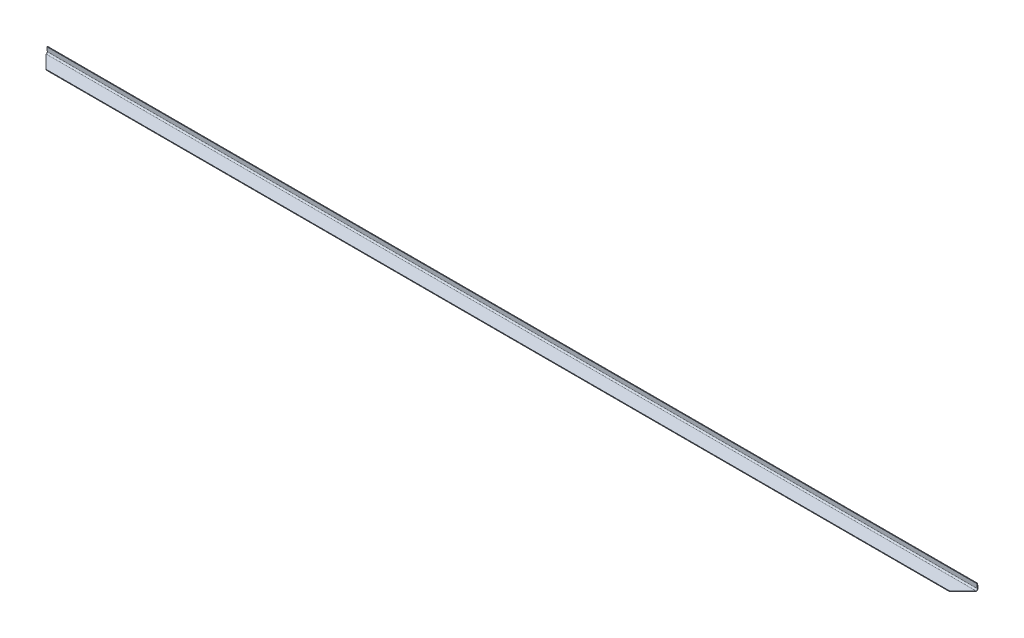
ISO-10303-21;
HEADER;
FILE_DESCRIPTION(('STEP AP214'),'2;1');
FILE_NAME('part.step','',(''),(''),'','','');
FILE_SCHEMA(('AUTOMOTIVE_DESIGN { 1 0 10303 214 1 1 1 1 }'));
ENDSEC;
DATA;
#1=APPLICATION_CONTEXT('core data for automotive mechanical design processes');
#2=APPLICATION_PROTOCOL_DEFINITION('international standard','automotive_design',2000,#1);
#3=PRODUCT_CONTEXT('',#1,'mechanical');
#4=PRODUCT('Part','Part','',(#3));
#5=PRODUCT_RELATED_PRODUCT_CATEGORY('part','',(#4));
#6=PRODUCT_DEFINITION_FORMATION('','',#4);
#7=PRODUCT_DEFINITION_CONTEXT('part definition',#1,'design');
#8=PRODUCT_DEFINITION('design','',#6,#7);
#9=PRODUCT_DEFINITION_SHAPE('','',#8);
#10=(LENGTH_UNIT() NAMED_UNIT(*) SI_UNIT(.MILLI.,.METRE.));
#11=(NAMED_UNIT(*) PLANE_ANGLE_UNIT() SI_UNIT($,.RADIAN.));
#12=(NAMED_UNIT(*) SI_UNIT($,.STERADIAN.) SOLID_ANGLE_UNIT());
#13=UNCERTAINTY_MEASURE_WITH_UNIT(LENGTH_MEASURE(1.E-05),#10,'distance_accuracy_value','');
#14=(GEOMETRIC_REPRESENTATION_CONTEXT(3) GLOBAL_UNCERTAINTY_ASSIGNED_CONTEXT((#13)) GLOBAL_UNIT_ASSIGNED_CONTEXT((#10,
#11,#12)) REPRESENTATION_CONTEXT('',''));
#15=CARTESIAN_POINT('',(0.,0.,0.));
#16=DIRECTION('',(0.,0.,1.));
#17=DIRECTION('',(1.,0.,0.));
#18=AXIS2_PLACEMENT_3D('',#15,#16,#17);
#19=CARTESIAN_POINT('',(20.,1.,20.0000000000002));
#20=DIRECTION('',(0.,0.,1.));
#21=DIRECTION('',(1.,0.,0.));
#22=AXIS2_PLACEMENT_3D('',#19,#20,#21);
#23=PLANE('',#22);
#24=DIRECTION('',(0.,1.,0.));
#25=VECTOR('',#24,1.);
#26=CARTESIAN_POINT('',(20.,1.,20.0000000000002));
#27=LINE('',#26,#25);
#28=CARTESIAN_POINT('',(20.,0.,20.0000000000002));
#29=VERTEX_POINT('',#28);
#30=CARTESIAN_POINT('',(20.,1.,20.0000000000002));
#31=VERTEX_POINT('',#30);
#32=EDGE_CURVE('E13',#29,#31,#27,.T.);
#33=ORIENTED_EDGE('',*,*,#32,.F.);
#34=DIRECTION('',(1.,0.,0.));
#35=VECTOR('',#34,1.);
#36=CARTESIAN_POINT('',(0.,0.,20.0000000000002));
#37=LINE('',#36,#35);
#38=CARTESIAN_POINT('',(1390.,0.,20.0000000000003));
#39=VERTEX_POINT('',#38);
#40=EDGE_CURVE('E135',#29,#39,#37,.T.);
#41=ORIENTED_EDGE('',*,*,#40,.T.);
#42=DIRECTION('',(0.,1.,0.));
#43=VECTOR('',#42,1.);
#44=CARTESIAN_POINT('',(1390.,1.,20.0000000000003));
#45=LINE('',#44,#43);
#46=CARTESIAN_POINT('',(1390.,1.,20.0000000000003));
#47=VERTEX_POINT('',#46);
#48=EDGE_CURVE('E67',#39,#47,#45,.T.);
#49=ORIENTED_EDGE('',*,*,#48,.T.);
#50=DIRECTION('',(1.,0.,0.));
#51=VECTOR('',#50,1.);
#52=CARTESIAN_POINT('',(20.,1.,20.0000000000002));
#53=LINE('',#52,#51);
#54=EDGE_CURVE('E120',#31,#47,#53,.T.);
#55=ORIENTED_EDGE('',*,*,#54,.F.);
#56=EDGE_LOOP('',(#33,#41,#49,#55));
#57=FACE_BOUND('',#56,.T.);
#58=ADVANCED_FACE('F57',(#57),#23,.T.);
#59=CARTESIAN_POINT('',(1390.,1.,20.0000000000003));
#60=DIRECTION('',(0.707106781186542,0.,0.707106781186554));
#61=DIRECTION('',(0.707106781186554,0.,-0.707106781186542));
#62=AXIS2_PLACEMENT_3D('',#59,#60,#61);
#63=PLANE('',#62);
#64=ORIENTED_EDGE('',*,*,#48,.F.);
#65=DIRECTION('',(0.707106781186554,0.,-0.707106781186542));
#66=VECTOR('',#65,1.);
#67=CARTESIAN_POINT('',(1390.,0.,20.0000000000003));
#68=LINE('',#67,#66);
#69=CARTESIAN_POINT('',(1410.,0.,0.));
#70=VERTEX_POINT('',#69);
#71=EDGE_CURVE('E133',#39,#70,#68,.T.);
#72=ORIENTED_EDGE('',*,*,#71,.T.);
#73=DIRECTION('',(0.,1.,0.));
#74=VECTOR('',#73,1.);
#75=CARTESIAN_POINT('',(1410.,1.,0.));
#76=LINE('',#75,#74);
#77=CARTESIAN_POINT('',(1410.,1.,0.));
#78=VERTEX_POINT('',#77);
#79=EDGE_CURVE('E75',#70,#78,#76,.T.);
#80=ORIENTED_EDGE('',*,*,#79,.T.);
#81=DIRECTION('',(0.707106781186554,0.,-0.707106781186542));
#82=VECTOR('',#81,1.);
#83=CARTESIAN_POINT('',(1390.,1.,20.0000000000003));
#84=LINE('',#83,#82);
#85=EDGE_CURVE('E124',#47,#78,#84,.T.);
#86=ORIENTED_EDGE('',*,*,#85,.F.);
#87=EDGE_LOOP('',(#64,#72,#80,#86));
#88=FACE_BOUND('',#87,.T.);
#89=ADVANCED_FACE('F225',(#88),#63,.T.);
#90=CARTESIAN_POINT('',(0.,1.,0.));
#91=DIRECTION('',(-0.707106781186551,0.,0.707106781186544));
#92=DIRECTION('',(0.707106781186544,0.,0.707106781186551));
#93=AXIS2_PLACEMENT_3D('',#90,#91,#92);
#94=PLANE('',#93);
#95=DIRECTION('',(0.707106781186544,0.,0.707106781186551));
#96=VECTOR('',#95,1.);
#97=CARTESIAN_POINT('',(0.,0.,0.));
#98=LINE('',#97,#96);
#99=CARTESIAN_POINT('',(0.,0.,0.));
#100=VERTEX_POINT('',#99);
#101=EDGE_CURVE('E98',#100,#29,#98,.T.);
#102=ORIENTED_EDGE('',*,*,#101,.T.);
#103=ORIENTED_EDGE('',*,*,#32,.T.);
#104=DIRECTION('',(0.707106781186544,0.,0.707106781186551));
#105=VECTOR('',#104,1.);
#106=CARTESIAN_POINT('',(0.,1.,0.));
#107=LINE('',#106,#105);
#108=CARTESIAN_POINT('',(0.,1.,0.));
#109=VERTEX_POINT('',#108);
#110=EDGE_CURVE('E115',#109,#31,#107,.T.);
#111=ORIENTED_EDGE('',*,*,#110,.F.);
#112=DIRECTION('',(0.,1.,0.));
#113=VECTOR('',#112,1.);
#114=CARTESIAN_POINT('',(0.,1.,0.));
#115=LINE('',#114,#113);
#116=EDGE_CURVE('E61',#100,#109,#115,.T.);
#117=ORIENTED_EDGE('',*,*,#116,.F.);
#118=EDGE_LOOP('',(#102,#103,#111,#117));
#119=FACE_BOUND('',#118,.T.);
#120=ADVANCED_FACE('F59',(#119),#94,.T.);
#121=CARTESIAN_POINT('',(0.,1.,0.));
#122=DIRECTION('',(0.,1.,0.));
#123=DIRECTION('',(0.,0.,1.));
#124=AXIS2_PLACEMENT_3D('',#121,#122,#123);
#125=PLANE('',#124);
#126=DIRECTION('',(-1.,0.,0.));
#127=VECTOR('',#126,1.);
#128=CARTESIAN_POINT('',(1410.,1.,0.));
#129=LINE('',#128,#127);
#130=EDGE_CURVE('E122',#78,#109,#129,.T.);
#131=ORIENTED_EDGE('',*,*,#130,.T.);
#132=ORIENTED_EDGE('',*,*,#110,.T.);
#133=ORIENTED_EDGE('',*,*,#54,.T.);
#134=ORIENTED_EDGE('',*,*,#85,.T.);
#135=EDGE_LOOP('',(#131,#132,#133,#134));
#136=FACE_BOUND('',#135,.T.);
#137=ADVANCED_FACE('F119',(#136),#125,.T.);
#138=CARTESIAN_POINT('',(0.,0.,0.));
#139=DIRECTION('',(0.,1.,0.));
#140=DIRECTION('',(0.,0.,1.));
#141=AXIS2_PLACEMENT_3D('',#138,#139,#140);
#142=PLANE('',#141);
#143=DIRECTION('',(1.,0.,0.));
#144=VECTOR('',#143,1.);
#145=CARTESIAN_POINT('',(0.,0.,0.));
#146=LINE('',#145,#144);
#147=EDGE_CURVE('E129',#70,#100,#146,.F.);
#148=ORIENTED_EDGE('',*,*,#147,.F.);
#149=ORIENTED_EDGE('',*,*,#71,.F.);
#150=ORIENTED_EDGE('',*,*,#40,.F.);
#151=ORIENTED_EDGE('',*,*,#101,.F.);
#152=EDGE_LOOP('',(#148,#149,#150,#151));
#153=FACE_BOUND('',#152,.T.);
#154=ADVANCED_FACE('F224',(#153),#142,.F.);
#155=CARTESIAN_POINT('',(1410.,3.,0.));
#156=DIRECTION('',(1.,0.,0.));
#157=DIRECTION('',(0.,0.,-1.));
#158=AXIS2_PLACEMENT_3D('',#155,#156,#157);
#159=PLANE('',#158);
#160=DIRECTION('',(0.,-0.0871557427476547,0.996194698091746));
#161=VECTOR('',#160,1.);
#162=CARTESIAN_POINT('',(1410.,3.26146722824297,-2.98858409427524));
#163=LINE('',#162,#161);
#164=CARTESIAN_POINT('',(1410.,3.17431148549531,-1.99238939618349));
#165=VERTEX_POINT('',#164);
#166=CARTESIAN_POINT('',(1410.,3.26146722824296,-2.98858409427524));
#167=VERTEX_POINT('',#166);
#168=EDGE_CURVE('E166',#165,#167,#163,.F.);
#169=ORIENTED_EDGE('',*,*,#168,.F.);
#170=CARTESIAN_POINT('',(1410.,3.,0.));
#171=DIRECTION('',(-1.,0.,0.));
#172=DIRECTION('',(0.,0.,1.));
#173=AXIS2_PLACEMENT_3D('',#170,#171,#172);
#174=CIRCLE('',#173,2.);
#175=EDGE_CURVE('E155',#78,#165,#174,.F.);
#176=ORIENTED_EDGE('',*,*,#175,.F.);
#177=ORIENTED_EDGE('',*,*,#79,.F.);
#178=CARTESIAN_POINT('',(1410.,3.,0.));
#179=DIRECTION('',(-1.,0.,0.));
#180=DIRECTION('',(0.,0.,1.));
#181=AXIS2_PLACEMENT_3D('',#178,#179,#180);
#182=CIRCLE('',#181,3.);
#183=EDGE_CURVE('E132',#70,#167,#182,.F.);
#184=ORIENTED_EDGE('',*,*,#183,.T.);
#185=EDGE_LOOP('',(#169,#176,#177,#184));
#186=FACE_BOUND('',#185,.T.);
#187=ADVANCED_FACE('F227',(#186),#159,.T.);
#188=CARTESIAN_POINT('',(0.,3.,0.));
#189=DIRECTION('',(1.,0.,0.));
#190=DIRECTION('',(0.,0.,-1.));
#191=AXIS2_PLACEMENT_3D('',#188,#189,#190);
#192=PLANE('',#191);
#193=CARTESIAN_POINT('',(0.,3.,0.));
#194=DIRECTION('',(-1.,0.,0.));
#195=DIRECTION('',(0.,0.,1.));
#196=AXIS2_PLACEMENT_3D('',#193,#194,#195);
#197=CIRCLE('',#196,2.);
#198=CARTESIAN_POINT('',(0.,3.17431148549531,-1.99238939618349));
#199=VERTEX_POINT('',#198);
#200=EDGE_CURVE('E145',#199,#109,#197,.T.);
#201=ORIENTED_EDGE('',*,*,#200,.F.);
#202=DIRECTION('',(0.,-0.0871557427476547,0.996194698091746));
#203=VECTOR('',#202,1.);
#204=CARTESIAN_POINT('',(0.,3.17431148549531,-1.99238939618349));
#205=LINE('',#204,#203);
#206=CARTESIAN_POINT('',(0.,3.26146722824296,-2.98858409427524));
#207=VERTEX_POINT('',#206);
#208=EDGE_CURVE('E170',#199,#207,#205,.F.);
#209=ORIENTED_EDGE('',*,*,#208,.T.);
#210=CARTESIAN_POINT('',(0.,3.,0.));
#211=DIRECTION('',(-1.,0.,0.));
#212=DIRECTION('',(0.,0.,1.));
#213=AXIS2_PLACEMENT_3D('',#210,#211,#212);
#214=CIRCLE('',#213,3.);
#215=EDGE_CURVE('E148',#207,#100,#214,.T.);
#216=ORIENTED_EDGE('',*,*,#215,.T.);
#217=ORIENTED_EDGE('',*,*,#116,.T.);
#218=EDGE_LOOP('',(#201,#209,#216,#217));
#219=FACE_BOUND('',#218,.T.);
#220=ADVANCED_FACE('F143',(#219),#192,.F.);
#221=CARTESIAN_POINT('',(0.,3.,0.));
#222=DIRECTION('',(-1.,0.,0.));
#223=DIRECTION('',(0.,0.0871557427476548,-0.996194698091746));
#224=AXIS2_PLACEMENT_3D('',#221,#222,#223);
#225=CYLINDRICAL_SURFACE('',#224,3.);
#226=ORIENTED_EDGE('',*,*,#147,.T.);
#227=ORIENTED_EDGE('',*,*,#215,.F.);
#228=DIRECTION('',(-1.,0.,0.));
#229=VECTOR('',#228,1.);
#230=CARTESIAN_POINT('',(1410.,3.26146722824296,-2.98858409427524));
#231=LINE('',#230,#229);
#232=EDGE_CURVE('E172',#207,#167,#231,.F.);
#233=ORIENTED_EDGE('',*,*,#232,.T.);
#234=ORIENTED_EDGE('',*,*,#183,.F.);
#235=EDGE_LOOP('',(#226,#227,#233,#234));
#236=FACE_BOUND('',#235,.T.);
#237=ADVANCED_FACE('F221',(#236),#225,.T.);
#238=CARTESIAN_POINT('',(0.,3.,0.));
#239=DIRECTION('',(-1.,0.,0.));
#240=DIRECTION('',(0.,0.0871557427476548,-0.996194698091746));
#241=AXIS2_PLACEMENT_3D('',#238,#239,#240);
#242=CYLINDRICAL_SURFACE('',#241,2.);
#243=ORIENTED_EDGE('',*,*,#130,.F.);
#244=ORIENTED_EDGE('',*,*,#175,.T.);
#245=DIRECTION('',(-1.,0.,0.));
#246=VECTOR('',#245,1.);
#247=CARTESIAN_POINT('',(1410.,3.17431148549531,-1.99238939618349));
#248=LINE('',#247,#246);
#249=EDGE_CURVE('E154',#165,#199,#248,.T.);
#250=ORIENTED_EDGE('',*,*,#249,.T.);
#251=ORIENTED_EDGE('',*,*,#200,.T.);
#252=EDGE_LOOP('',(#243,#244,#250,#251));
#253=FACE_BOUND('',#252,.T.);
#254=ADVANCED_FACE('F150',(#253),#242,.F.);
#255=CARTESIAN_POINT('',(1410.,1.08715574274765,-3.17881170023028));
#256=DIRECTION('',(-1.,0.,0.));
#257=DIRECTION('',(0.,0.,1.));
#258=AXIS2_PLACEMENT_3D('',#255,#256,#257);
#259=PLANE('',#258);
#260=ORIENTED_EDGE('',*,*,#168,.T.);
#261=DIRECTION('',(0.,-0.996194698091746,-0.0871557427476548));
#262=VECTOR('',#261,1.);
#263=CARTESIAN_POINT('',(1410.,0.0947518662415502,-3.26563578906374));
#264=LINE('',#263,#262);
#265=CARTESIAN_POINT('',(1410.,9.96194698091746,-2.40236807573126));
#266=VERTEX_POINT('',#265);
#267=EDGE_CURVE('E183',#266,#167,#264,.T.);
#268=ORIENTED_EDGE('',*,*,#267,.F.);
#269=DIRECTION('',(0.,-0.0871557427476548,0.996194698091746));
#270=VECTOR('',#269,1.);
#271=CARTESIAN_POINT('',(1410.,9.96194698091746,-2.40236807573126));
#272=LINE('',#271,#270);
#273=CARTESIAN_POINT('',(1410.,9.8747912381698,-1.40617337763951));
#274=VERTEX_POINT('',#273);
#275=EDGE_CURVE('E160',#266,#274,#272,.T.);
#276=ORIENTED_EDGE('',*,*,#275,.T.);
#277=DIRECTION('',(0.,0.996194698091746,0.0871557427476548));
#278=VECTOR('',#277,1.);
#279=CARTESIAN_POINT('',(1410.,1.,-2.18261700213854));
#280=LINE('',#279,#278);
#281=EDGE_CURVE('E174',#274,#165,#280,.F.);
#282=ORIENTED_EDGE('',*,*,#281,.T.);
#283=EDGE_LOOP('',(#260,#268,#276,#282));
#284=FACE_BOUND('',#283,.T.);
#285=ADVANCED_FACE('F198',(#284),#259,.F.);
#286=CARTESIAN_POINT('',(0.,9.96194698091746,-2.40236807573125));
#287=DIRECTION('',(1.,0.,0.));
#288=DIRECTION('',(0.,0.,-1.));
#289=AXIS2_PLACEMENT_3D('',#286,#287,#288);
#290=PLANE('',#289);
#291=ORIENTED_EDGE('',*,*,#208,.F.);
#292=DIRECTION('',(0.,-0.996194698091746,-0.0871557427476548));
#293=VECTOR('',#292,1.);
#294=CARTESIAN_POINT('',(0.,9.8747912381698,-1.40617337763951));
#295=LINE('',#294,#293);
#296=CARTESIAN_POINT('',(0.,9.8747912381698,-1.40617337763951));
#297=VERTEX_POINT('',#296);
#298=EDGE_CURVE('E177',#199,#297,#295,.F.);
#299=ORIENTED_EDGE('',*,*,#298,.T.);
#300=DIRECTION('',(0.,-0.0871557427476548,0.996194698091746));
#301=VECTOR('',#300,1.);
#302=CARTESIAN_POINT('',(0.,9.96194698091746,-2.40236807573125));
#303=LINE('',#302,#301);
#304=CARTESIAN_POINT('',(0.,9.96194698091746,-2.40236807573125));
#305=VERTEX_POINT('',#304);
#306=EDGE_CURVE('E156',#305,#297,#303,.T.);
#307=ORIENTED_EDGE('',*,*,#306,.F.);
#308=DIRECTION('',(0.,0.996194698091746,0.0871557427476548));
#309=VECTOR('',#308,1.);
#310=CARTESIAN_POINT('',(0.,0.0947518662415502,-3.26563578906374));
#311=LINE('',#310,#309);
#312=EDGE_CURVE('E186',#207,#305,#311,.T.);
#313=ORIENTED_EDGE('',*,*,#312,.F.);
#314=EDGE_LOOP('',(#291,#299,#307,#313));
#315=FACE_BOUND('',#314,.T.);
#316=ADVANCED_FACE('F210',(#315),#290,.F.);
#317=CARTESIAN_POINT('',(0.,0.0947518662415502,-3.26563578906374));
#318=DIRECTION('',(0.,-0.0871557427476548,0.996194698091746));
#319=DIRECTION('',(0.,-0.996194698091746,-0.0871557427476548));
#320=AXIS2_PLACEMENT_3D('',#317,#318,#319);
#321=PLANE('',#320);
#322=ORIENTED_EDGE('',*,*,#232,.F.);
#323=ORIENTED_EDGE('',*,*,#312,.T.);
#324=DIRECTION('',(1.,0.,0.));
#325=VECTOR('',#324,1.);
#326=CARTESIAN_POINT('',(0.,9.96194698091746,-2.40236807573125));
#327=LINE('',#326,#325);
#328=EDGE_CURVE('E189',#305,#266,#327,.T.);
#329=ORIENTED_EDGE('',*,*,#328,.T.);
#330=ORIENTED_EDGE('',*,*,#267,.T.);
#331=EDGE_LOOP('',(#322,#323,#329,#330));
#332=FACE_BOUND('',#331,.T.);
#333=ADVANCED_FACE('F218',(#332),#321,.F.);
#334=CARTESIAN_POINT('',(0.,0.0075961234938954,-2.269441090972));
#335=DIRECTION('',(0.,-0.0871557427476548,0.996194698091746));
#336=DIRECTION('',(0.,-0.996194698091746,-0.0871557427476548));
#337=AXIS2_PLACEMENT_3D('',#334,#335,#336);
#338=PLANE('',#337);
#339=ORIENTED_EDGE('',*,*,#298,.F.);
#340=ORIENTED_EDGE('',*,*,#249,.F.);
#341=ORIENTED_EDGE('',*,*,#281,.F.);
#342=DIRECTION('',(-1.,0.,0.));
#343=VECTOR('',#342,1.);
#344=CARTESIAN_POINT('',(1410.,9.8747912381698,-1.40617337763951));
#345=LINE('',#344,#343);
#346=EDGE_CURVE('E180',#297,#274,#345,.F.);
#347=ORIENTED_EDGE('',*,*,#346,.F.);
#348=EDGE_LOOP('',(#339,#340,#341,#347));
#349=FACE_BOUND('',#348,.T.);
#350=ADVANCED_FACE('F207',(#349),#338,.T.);
#351=CARTESIAN_POINT('',(1410.,9.96194698091746,-2.40236807573126));
#352=DIRECTION('',(0.,-0.996194698091746,-0.0871557427476548));
#353=DIRECTION('',(0.,0.0871557427476548,-0.996194698091746));
#354=AXIS2_PLACEMENT_3D('',#351,#352,#353);
#355=PLANE('',#354);
#356=ORIENTED_EDGE('',*,*,#346,.T.);
#357=ORIENTED_EDGE('',*,*,#275,.F.);
#358=ORIENTED_EDGE('',*,*,#328,.F.);
#359=ORIENTED_EDGE('',*,*,#306,.T.);
#360=EDGE_LOOP('',(#356,#357,#358,#359));
#361=FACE_BOUND('',#360,.T.);
#362=ADVANCED_FACE('F214',(#361),#355,.F.);
#363=CLOSED_SHELL('',(#58,#89,#120,#137,#154,#187,#220,#237,#254,#285,#316,#333,#350,#362));
#364=MANIFOLD_SOLID_BREP('B2',#363);
#365=ADVANCED_BREP_SHAPE_REPRESENTATION('',(#18,#364),#14);
#366=SHAPE_DEFINITION_REPRESENTATION(#9,#365);
ENDSEC;
END-ISO-10303-21;
